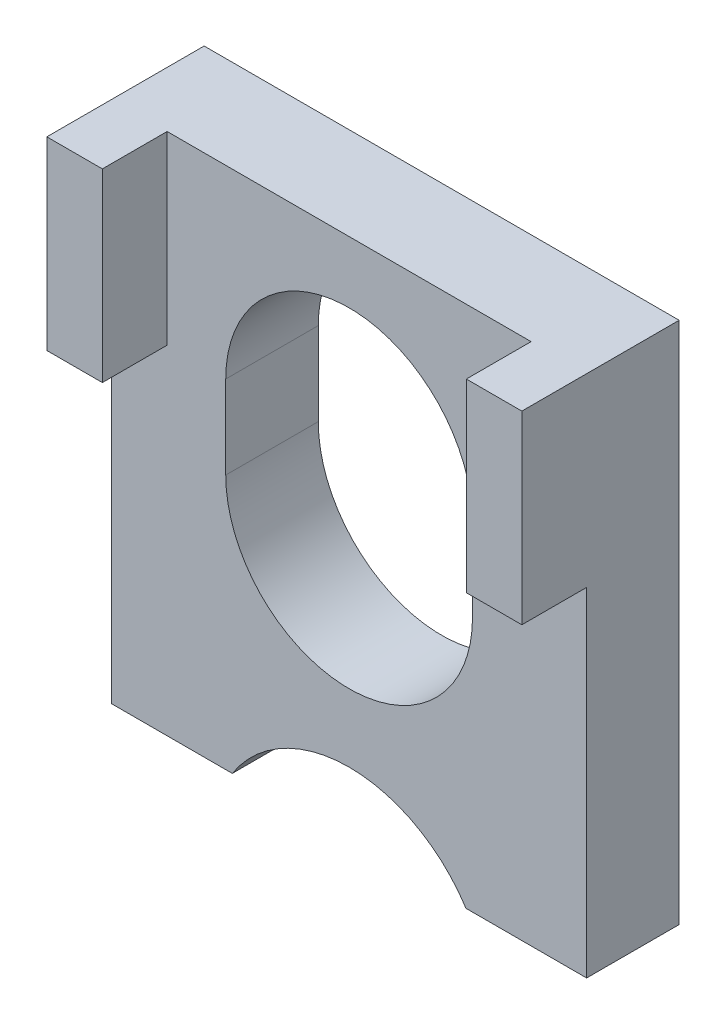
ISO-10303-21;
HEADER;
FILE_DESCRIPTION(('STEP AP214'),'2;1');
FILE_NAME('part.step','',(''),(''),'','','');
FILE_SCHEMA(('AUTOMOTIVE_DESIGN { 1 0 10303 214 1 1 1 1 }'));
ENDSEC;
DATA;
#1=APPLICATION_CONTEXT('core data for automotive mechanical design processes');
#2=APPLICATION_PROTOCOL_DEFINITION('international standard','automotive_design',2000,#1);
#3=PRODUCT_CONTEXT('',#1,'mechanical');
#4=PRODUCT('Part','Part','',(#3));
#5=PRODUCT_RELATED_PRODUCT_CATEGORY('part','',(#4));
#6=PRODUCT_DEFINITION_FORMATION('','',#4);
#7=PRODUCT_DEFINITION_CONTEXT('part definition',#1,'design');
#8=PRODUCT_DEFINITION('design','',#6,#7);
#9=PRODUCT_DEFINITION_SHAPE('','',#8);
#10=(LENGTH_UNIT() NAMED_UNIT(*) SI_UNIT(.MILLI.,.METRE.));
#11=(NAMED_UNIT(*) PLANE_ANGLE_UNIT() SI_UNIT($,.RADIAN.));
#12=(NAMED_UNIT(*) SI_UNIT($,.STERADIAN.) SOLID_ANGLE_UNIT());
#13=UNCERTAINTY_MEASURE_WITH_UNIT(LENGTH_MEASURE(1.E-05),#10,'distance_accuracy_value','');
#14=(GEOMETRIC_REPRESENTATION_CONTEXT(3) GLOBAL_UNCERTAINTY_ASSIGNED_CONTEXT((#13)) GLOBAL_UNIT_ASSIGNED_CONTEXT((#10,
#11,#12)) REPRESENTATION_CONTEXT('',''));
#15=CARTESIAN_POINT('',(0.,0.,0.));
#16=DIRECTION('',(0.,0.,1.));
#17=DIRECTION('',(1.,0.,0.));
#18=AXIS2_PLACEMENT_3D('',#15,#16,#17);
#19=CARTESIAN_POINT('',(0.,-5.65897627091936,3.));
#20=DIRECTION('',(0.,0.,-1.));
#21=DIRECTION('',(-1.,0.,0.));
#22=AXIS2_PLACEMENT_3D('',#19,#20,#21);
#23=PLANE('',#22);
#24=CARTESIAN_POINT('',(0.,7.73749960693732,3.));
#25=DIRECTION('',(0.,0.,1.));
#26=DIRECTION('',(1.,0.,0.));
#27=AXIS2_PLACEMENT_3D('',#24,#25,#26);
#28=CIRCLE('',#27,4.);
#29=CARTESIAN_POINT('',(4.,7.73749960693732,3.));
#30=VERTEX_POINT('',#29);
#31=CARTESIAN_POINT('',(-4.,7.73749960693732,3.));
#32=VERTEX_POINT('',#31);
#33=EDGE_CURVE('E211',#30,#32,#28,.T.);
#34=ORIENTED_EDGE('',*,*,#33,.F.);
#35=DIRECTION('',(0.,1.,0.));
#36=VECTOR('',#35,1.);
#37=CARTESIAN_POINT('',(4.,7.73749960693732,3.));
#38=LINE('',#37,#36);
#39=CARTESIAN_POINT('',(4.,5.04102372908064,3.));
#40=VERTEX_POINT('',#39);
#41=EDGE_CURVE('E219',#40,#30,#38,.T.);
#42=ORIENTED_EDGE('',*,*,#41,.F.);
#43=CARTESIAN_POINT('',(0.,5.04102372908064,3.));
#44=DIRECTION('',(0.,0.,1.));
#45=DIRECTION('',(1.,0.,0.));
#46=AXIS2_PLACEMENT_3D('',#43,#44,#45);
#47=CIRCLE('',#46,4.);
#48=CARTESIAN_POINT('',(-4.,5.04102372908064,3.));
#49=VERTEX_POINT('',#48);
#50=EDGE_CURVE('E216',#49,#40,#47,.T.);
#51=ORIENTED_EDGE('',*,*,#50,.F.);
#52=DIRECTION('',(0.,-1.,0.));
#53=VECTOR('',#52,1.);
#54=CARTESIAN_POINT('',(-4.,7.73749960693732,3.));
#55=LINE('',#54,#53);
#56=EDGE_CURVE('E213',#32,#49,#55,.T.);
#57=ORIENTED_EDGE('',*,*,#56,.F.);
#58=EDGE_LOOP('',(#34,#42,#51,#57));
#59=FACE_BOUND('',#58,.T.);
#60=DIRECTION('',(0.,-1.,0.));
#61=VECTOR('',#60,1.);
#62=CARTESIAN_POINT('',(5.9,13.7374996069373,3.));
#63=LINE('',#62,#61);
#64=CARTESIAN_POINT('',(5.9,13.7374996069373,3.));
#65=VERTEX_POINT('',#64);
#66=CARTESIAN_POINT('',(5.9,7.73749960693732,3.));
#67=VERTEX_POINT('',#66);
#68=EDGE_CURVE('E173',#65,#67,#63,.T.);
#69=ORIENTED_EDGE('',*,*,#68,.F.);
#70=DIRECTION('',(-1.,0.,0.));
#71=VECTOR('',#70,1.);
#72=CARTESIAN_POINT('',(-7.7,13.7374996069373,3.));
#73=LINE('',#72,#71);
#74=CARTESIAN_POINT('',(-5.9,13.7374996069373,3.));
#75=VERTEX_POINT('',#74);
#76=EDGE_CURVE('E252',#65,#75,#73,.T.);
#77=ORIENTED_EDGE('',*,*,#76,.T.);
#78=DIRECTION('',(0.,1.,0.));
#79=VECTOR('',#78,1.);
#80=CARTESIAN_POINT('',(-5.9,13.7374996069373,3.));
#81=LINE('',#80,#79);
#82=CARTESIAN_POINT('',(-5.9,7.73749960693732,3.));
#83=VERTEX_POINT('',#82);
#84=EDGE_CURVE('E190',#83,#75,#81,.T.);
#85=ORIENTED_EDGE('',*,*,#84,.F.);
#86=DIRECTION('',(1.,0.,0.));
#87=VECTOR('',#86,1.);
#88=CARTESIAN_POINT('',(-7.7,7.73749960693732,3.));
#89=LINE('',#88,#87);
#90=CARTESIAN_POINT('',(-7.7,7.73749960693732,3.));
#91=VERTEX_POINT('',#90);
#92=EDGE_CURVE('E185',#91,#83,#89,.T.);
#93=ORIENTED_EDGE('',*,*,#92,.F.);
#94=DIRECTION('',(0.,-1.,0.));
#95=VECTOR('',#94,1.);
#96=CARTESIAN_POINT('',(-7.7,13.7374996069373,3.));
#97=LINE('',#96,#95);
#98=CARTESIAN_POINT('',(-7.7,-3.22973558864937,3.));
#99=VERTEX_POINT('',#98);
#100=EDGE_CURVE('E242',#91,#99,#97,.T.);
#101=ORIENTED_EDGE('',*,*,#100,.T.);
#102=DIRECTION('',(1.,0.,0.));
#103=VECTOR('',#102,1.);
#104=CARTESIAN_POINT('',(-7.7,-3.22973558864937,3.));
#105=LINE('',#104,#103);
#106=CARTESIAN_POINT('',(-3.78797963400074,-3.22973558864937,3.));
#107=VERTEX_POINT('',#106);
#108=EDGE_CURVE('E244',#99,#107,#105,.T.);
#109=ORIENTED_EDGE('',*,*,#108,.T.);
#110=CARTESIAN_POINT('',(0.,-5.65897627091936,3.));
#111=DIRECTION('',(0.,0.,-1.));
#112=DIRECTION('',(-1.,0.,0.));
#113=AXIS2_PLACEMENT_3D('',#110,#111,#112);
#114=CIRCLE('',#113,4.5);
#115=CARTESIAN_POINT('',(3.78797963400074,-3.22973558864937,3.));
#116=VERTEX_POINT('',#115);
#117=EDGE_CURVE('E247',#107,#116,#114,.T.);
#118=ORIENTED_EDGE('',*,*,#117,.T.);
#119=DIRECTION('',(1.,0.,0.));
#120=VECTOR('',#119,1.);
#121=CARTESIAN_POINT('',(7.7,-3.22973558864937,3.));
#122=LINE('',#121,#120);
#123=CARTESIAN_POINT('',(7.7,-3.22973558864937,3.));
#124=VERTEX_POINT('',#123);
#125=EDGE_CURVE('E249',#116,#124,#122,.T.);
#126=ORIENTED_EDGE('',*,*,#125,.T.);
#127=DIRECTION('',(0.,1.,0.));
#128=VECTOR('',#127,1.);
#129=CARTESIAN_POINT('',(7.7,-0.0396047922675049,3.));
#130=LINE('',#129,#128);
#131=CARTESIAN_POINT('',(7.7,7.73749960693732,3.));
#132=VERTEX_POINT('',#131);
#133=EDGE_CURVE('E53',#124,#132,#130,.T.);
#134=ORIENTED_EDGE('',*,*,#133,.T.);
#135=DIRECTION('',(1.,0.,0.));
#136=VECTOR('',#135,1.);
#137=CARTESIAN_POINT('',(7.7,7.73749960693732,3.));
#138=LINE('',#137,#136);
#139=EDGE_CURVE('E48',#67,#132,#138,.T.);
#140=ORIENTED_EDGE('',*,*,#139,.F.);
#141=EDGE_LOOP('',(#69,#77,#85,#93,#101,#109,#118,#126,#134,#140));
#142=FACE_BOUND('',#141,.T.);
#143=ADVANCED_FACE('F33',(#59,#142),#23,.F.);
#144=CARTESIAN_POINT('',(0.,-5.65897627091936,0.));
#145=DIRECTION('',(0.,0.,-1.));
#146=DIRECTION('',(-1.,0.,0.));
#147=AXIS2_PLACEMENT_3D('',#144,#145,#146);
#148=PLANE('',#147);
#149=DIRECTION('',(0.,-1.,0.));
#150=VECTOR('',#149,1.);
#151=CARTESIAN_POINT('',(-7.7,-0.0396047922675089,0.));
#152=LINE('',#151,#150);
#153=CARTESIAN_POINT('',(-7.7,13.7374996069373,0.));
#154=VERTEX_POINT('',#153);
#155=CARTESIAN_POINT('',(-7.7,-3.22973558864937,0.));
#156=VERTEX_POINT('',#155);
#157=EDGE_CURVE('E241',#154,#156,#152,.T.);
#158=ORIENTED_EDGE('',*,*,#157,.F.);
#159=DIRECTION('',(-1.,0.,0.));
#160=VECTOR('',#159,1.);
#161=CARTESIAN_POINT('',(-7.7,13.7374996069373,0.));
#162=LINE('',#161,#160);
#163=CARTESIAN_POINT('',(7.7,13.7374996069373,0.));
#164=VERTEX_POINT('',#163);
#165=EDGE_CURVE('E245',#164,#154,#162,.T.);
#166=ORIENTED_EDGE('',*,*,#165,.F.);
#167=DIRECTION('',(0.,1.,0.));
#168=VECTOR('',#167,1.);
#169=CARTESIAN_POINT('',(7.7,13.7374996069373,0.));
#170=LINE('',#169,#168);
#171=CARTESIAN_POINT('',(7.7,-3.22973558864937,0.));
#172=VERTEX_POINT('',#171);
#173=EDGE_CURVE('E152',#172,#164,#170,.T.);
#174=ORIENTED_EDGE('',*,*,#173,.F.);
#175=DIRECTION('',(1.,0.,0.));
#176=VECTOR('',#175,1.);
#177=CARTESIAN_POINT('',(7.7,-3.22973558864937,0.));
#178=LINE('',#177,#176);
#179=CARTESIAN_POINT('',(3.78797963400074,-3.22973558864937,0.));
#180=VERTEX_POINT('',#179);
#181=EDGE_CURVE('E259',#180,#172,#178,.T.);
#182=ORIENTED_EDGE('',*,*,#181,.F.);
#183=CARTESIAN_POINT('',(0.,-5.65897627091936,0.));
#184=DIRECTION('',(0.,0.,-1.));
#185=DIRECTION('',(-1.,0.,0.));
#186=AXIS2_PLACEMENT_3D('',#183,#184,#185);
#187=CIRCLE('',#186,4.5);
#188=CARTESIAN_POINT('',(-3.78797963400074,-3.22973558864937,0.));
#189=VERTEX_POINT('',#188);
#190=EDGE_CURVE('E257',#189,#180,#187,.T.);
#191=ORIENTED_EDGE('',*,*,#190,.F.);
#192=DIRECTION('',(1.,0.,0.));
#193=VECTOR('',#192,1.);
#194=CARTESIAN_POINT('',(-7.7,-3.22973558864937,0.));
#195=LINE('',#194,#193);
#196=EDGE_CURVE('E255',#156,#189,#195,.T.);
#197=ORIENTED_EDGE('',*,*,#196,.F.);
#198=EDGE_LOOP('',(#158,#166,#174,#182,#191,#197));
#199=FACE_BOUND('',#198,.T.);
#200=DIRECTION('',(0.,1.,0.));
#201=VECTOR('',#200,1.);
#202=CARTESIAN_POINT('',(4.,7.73749960693732,0.));
#203=LINE('',#202,#201);
#204=CARTESIAN_POINT('',(4.,5.04102372908064,0.));
#205=VERTEX_POINT('',#204);
#206=CARTESIAN_POINT('',(4.,7.73749960693732,0.));
#207=VERTEX_POINT('',#206);
#208=EDGE_CURVE('E214',#205,#207,#203,.T.);
#209=ORIENTED_EDGE('',*,*,#208,.T.);
#210=CARTESIAN_POINT('',(0.,7.73749960693732,0.));
#211=DIRECTION('',(0.,0.,1.));
#212=DIRECTION('',(1.,0.,0.));
#213=AXIS2_PLACEMENT_3D('',#210,#211,#212);
#214=CIRCLE('',#213,4.);
#215=CARTESIAN_POINT('',(-4.,7.73749960693732,0.));
#216=VERTEX_POINT('',#215);
#217=EDGE_CURVE('E210',#207,#216,#214,.T.);
#218=ORIENTED_EDGE('',*,*,#217,.T.);
#219=DIRECTION('',(0.,-1.,0.));
#220=VECTOR('',#219,1.);
#221=CARTESIAN_POINT('',(-4.,7.73749960693732,0.));
#222=LINE('',#221,#220);
#223=CARTESIAN_POINT('',(-4.,5.04102372908064,0.));
#224=VERTEX_POINT('',#223);
#225=EDGE_CURVE('E224',#216,#224,#222,.T.);
#226=ORIENTED_EDGE('',*,*,#225,.T.);
#227=CARTESIAN_POINT('',(0.,5.04102372908064,0.));
#228=DIRECTION('',(0.,0.,1.));
#229=DIRECTION('',(1.,0.,0.));
#230=AXIS2_PLACEMENT_3D('',#227,#228,#229);
#231=CIRCLE('',#230,4.);
#232=EDGE_CURVE('E227',#224,#205,#231,.T.);
#233=ORIENTED_EDGE('',*,*,#232,.T.);
#234=EDGE_LOOP('',(#209,#218,#226,#233));
#235=FACE_BOUND('',#234,.T.);
#236=ADVANCED_FACE('F281',(#199,#235),#148,.T.);
#237=CARTESIAN_POINT('',(-7.7,-0.0396047922675089,3.));
#238=DIRECTION('',(1.,0.,0.));
#239=DIRECTION('',(0.,0.,-1.));
#240=AXIS2_PLACEMENT_3D('',#237,#238,#239);
#241=PLANE('',#240);
#242=ORIENTED_EDGE('',*,*,#157,.T.);
#243=DIRECTION('',(0.,0.,-1.));
#244=VECTOR('',#243,1.);
#245=CARTESIAN_POINT('',(-7.7,-3.22973558864937,3.));
#246=LINE('',#245,#244);
#247=EDGE_CURVE('E11',#99,#156,#246,.T.);
#248=ORIENTED_EDGE('',*,*,#247,.F.);
#249=ORIENTED_EDGE('',*,*,#100,.F.);
#250=DIRECTION('',(0.,0.,-1.));
#251=VECTOR('',#250,1.);
#252=CARTESIAN_POINT('',(-7.7,7.73749960693732,5.1));
#253=LINE('',#252,#251);
#254=CARTESIAN_POINT('',(-7.7,7.73749960693732,5.1));
#255=VERTEX_POINT('',#254);
#256=EDGE_CURVE('E207',#255,#91,#253,.T.);
#257=ORIENTED_EDGE('',*,*,#256,.F.);
#258=DIRECTION('',(0.,-1.,0.));
#259=VECTOR('',#258,1.);
#260=CARTESIAN_POINT('',(-7.7,13.7374996069373,5.1));
#261=LINE('',#260,#259);
#262=CARTESIAN_POINT('',(-7.7,13.7374996069373,5.1));
#263=VERTEX_POINT('',#262);
#264=EDGE_CURVE('E186',#263,#255,#261,.T.);
#265=ORIENTED_EDGE('',*,*,#264,.F.);
#266=DIRECTION('',(0.,0.,-1.));
#267=VECTOR('',#266,1.);
#268=CARTESIAN_POINT('',(-7.7,13.7374996069373,3.));
#269=LINE('',#268,#267);
#270=EDGE_CURVE('E157',#263,#154,#269,.T.);
#271=ORIENTED_EDGE('',*,*,#270,.T.);
#272=EDGE_LOOP('',(#242,#248,#249,#257,#265,#271));
#273=FACE_BOUND('',#272,.T.);
#274=ADVANCED_FACE('F35',(#273),#241,.F.);
#275=CARTESIAN_POINT('',(-7.7,-3.22973558864937,3.));
#276=DIRECTION('',(0.,1.,0.));
#277=DIRECTION('',(0.,0.,1.));
#278=AXIS2_PLACEMENT_3D('',#275,#276,#277);
#279=PLANE('',#278);
#280=ORIENTED_EDGE('',*,*,#196,.T.);
#281=DIRECTION('',(0.,0.,-1.));
#282=VECTOR('',#281,1.);
#283=CARTESIAN_POINT('',(-3.78797963400074,-3.22973558864937,3.));
#284=LINE('',#283,#282);
#285=EDGE_CURVE('E41',#107,#189,#284,.T.);
#286=ORIENTED_EDGE('',*,*,#285,.F.);
#287=ORIENTED_EDGE('',*,*,#108,.F.);
#288=ORIENTED_EDGE('',*,*,#247,.T.);
#289=EDGE_LOOP('',(#280,#286,#287,#288));
#290=FACE_BOUND('',#289,.T.);
#291=ADVANCED_FACE('F307',(#290),#279,.F.);
#292=CARTESIAN_POINT('',(0.,-5.65897627091936,3.));
#293=DIRECTION('',(0.,0.,-1.));
#294=DIRECTION('',(-1.,0.,0.));
#295=AXIS2_PLACEMENT_3D('',#292,#293,#294);
#296=CYLINDRICAL_SURFACE('',#295,4.5);
#297=ORIENTED_EDGE('',*,*,#190,.T.);
#298=DIRECTION('',(0.,0.,-1.));
#299=VECTOR('',#298,1.);
#300=CARTESIAN_POINT('',(3.78797963400074,-3.22973558864937,3.));
#301=LINE('',#300,#299);
#302=EDGE_CURVE('E267',#116,#180,#301,.T.);
#303=ORIENTED_EDGE('',*,*,#302,.F.);
#304=ORIENTED_EDGE('',*,*,#117,.F.);
#305=ORIENTED_EDGE('',*,*,#285,.T.);
#306=EDGE_LOOP('',(#297,#303,#304,#305));
#307=FACE_BOUND('',#306,.T.);
#308=ADVANCED_FACE('F274',(#307),#296,.F.);
#309=CARTESIAN_POINT('',(7.7,-3.22973558864937,3.));
#310=DIRECTION('',(0.,1.,0.));
#311=DIRECTION('',(-1.,0.,0.));
#312=AXIS2_PLACEMENT_3D('',#309,#310,#311);
#313=PLANE('',#312);
#314=ORIENTED_EDGE('',*,*,#181,.T.);
#315=DIRECTION('',(0.,0.,-1.));
#316=VECTOR('',#315,1.);
#317=CARTESIAN_POINT('',(7.7,-3.22973558864937,3.));
#318=LINE('',#317,#316);
#319=EDGE_CURVE('E156',#124,#172,#318,.T.);
#320=ORIENTED_EDGE('',*,*,#319,.F.);
#321=ORIENTED_EDGE('',*,*,#125,.F.);
#322=ORIENTED_EDGE('',*,*,#302,.T.);
#323=EDGE_LOOP('',(#314,#320,#321,#322));
#324=FACE_BOUND('',#323,.T.);
#325=ADVANCED_FACE('F285',(#324),#313,.F.);
#326=CARTESIAN_POINT('',(7.7,13.7374996069373,3.));
#327=DIRECTION('',(-1.,0.,0.));
#328=DIRECTION('',(0.,-1.,0.));
#329=AXIS2_PLACEMENT_3D('',#326,#327,#328);
#330=PLANE('',#329);
#331=ORIENTED_EDGE('',*,*,#173,.T.);
#332=DIRECTION('',(0.,0.,-1.));
#333=VECTOR('',#332,1.);
#334=CARTESIAN_POINT('',(7.7,13.7374996069373,3.));
#335=LINE('',#334,#333);
#336=CARTESIAN_POINT('',(7.7,13.7374996069373,5.1));
#337=VERTEX_POINT('',#336);
#338=EDGE_CURVE('E145',#337,#164,#335,.T.);
#339=ORIENTED_EDGE('',*,*,#338,.F.);
#340=DIRECTION('',(0.,1.,0.));
#341=VECTOR('',#340,1.);
#342=CARTESIAN_POINT('',(7.7,13.7374996069373,5.1));
#343=LINE('',#342,#341);
#344=CARTESIAN_POINT('',(7.7,7.73749960693732,5.1));
#345=VERTEX_POINT('',#344);
#346=EDGE_CURVE('E150',#345,#337,#343,.T.);
#347=ORIENTED_EDGE('',*,*,#346,.F.);
#348=DIRECTION('',(0.,0.,-1.));
#349=VECTOR('',#348,1.);
#350=CARTESIAN_POINT('',(7.7,7.73749960693732,5.1));
#351=LINE('',#350,#349);
#352=EDGE_CURVE('E178',#345,#132,#351,.T.);
#353=ORIENTED_EDGE('',*,*,#352,.T.);
#354=ORIENTED_EDGE('',*,*,#133,.F.);
#355=ORIENTED_EDGE('',*,*,#319,.T.);
#356=EDGE_LOOP('',(#331,#339,#347,#353,#354,#355));
#357=FACE_BOUND('',#356,.T.);
#358=ADVANCED_FACE('F147',(#357),#330,.F.);
#359=CARTESIAN_POINT('',(-7.7,13.7374996069373,3.));
#360=DIRECTION('',(0.,-1.,0.));
#361=DIRECTION('',(0.,0.,-1.));
#362=AXIS2_PLACEMENT_3D('',#359,#360,#361);
#363=PLANE('',#362);
#364=ORIENTED_EDGE('',*,*,#165,.T.);
#365=ORIENTED_EDGE('',*,*,#270,.F.);
#366=DIRECTION('',(-1.,0.,0.));
#367=VECTOR('',#366,1.);
#368=CARTESIAN_POINT('',(-7.7,13.7374996069373,5.1));
#369=LINE('',#368,#367);
#370=CARTESIAN_POINT('',(-5.9,13.7374996069373,5.1));
#371=VERTEX_POINT('',#370);
#372=EDGE_CURVE('E194',#371,#263,#369,.T.);
#373=ORIENTED_EDGE('',*,*,#372,.F.);
#374=DIRECTION('',(0.,0.,-1.));
#375=VECTOR('',#374,1.);
#376=CARTESIAN_POINT('',(-5.9,13.7374996069373,5.1));
#377=LINE('',#376,#375);
#378=EDGE_CURVE('E197',#371,#75,#377,.T.);
#379=ORIENTED_EDGE('',*,*,#378,.T.);
#380=ORIENTED_EDGE('',*,*,#76,.F.);
#381=DIRECTION('',(0.,0.,-1.));
#382=VECTOR('',#381,1.);
#383=CARTESIAN_POINT('',(5.9,13.7374996069373,5.1));
#384=LINE('',#383,#382);
#385=CARTESIAN_POINT('',(5.9,13.7374996069373,5.1));
#386=VERTEX_POINT('',#385);
#387=EDGE_CURVE('E163',#386,#65,#384,.T.);
#388=ORIENTED_EDGE('',*,*,#387,.F.);
#389=DIRECTION('',(-1.,0.,0.));
#390=VECTOR('',#389,1.);
#391=CARTESIAN_POINT('',(7.7,13.7374996069373,5.1));
#392=LINE('',#391,#390);
#393=EDGE_CURVE('E160',#337,#386,#392,.T.);
#394=ORIENTED_EDGE('',*,*,#393,.F.);
#395=ORIENTED_EDGE('',*,*,#338,.T.);
#396=EDGE_LOOP('',(#364,#365,#373,#379,#380,#388,#394,#395));
#397=FACE_BOUND('',#396,.T.);
#398=ADVANCED_FACE('F161',(#397),#363,.F.);
#399=CARTESIAN_POINT('',(0.,7.73749960693732,3.));
#400=DIRECTION('',(0.,0.,-1.));
#401=DIRECTION('',(-1.,0.,0.));
#402=AXIS2_PLACEMENT_3D('',#399,#400,#401);
#403=CYLINDRICAL_SURFACE('',#402,4.);
#404=ORIENTED_EDGE('',*,*,#217,.F.);
#405=DIRECTION('',(0.,0.,-1.));
#406=VECTOR('',#405,1.);
#407=CARTESIAN_POINT('',(4.,7.73749960693732,3.));
#408=LINE('',#407,#406);
#409=EDGE_CURVE('E221',#30,#207,#408,.T.);
#410=ORIENTED_EDGE('',*,*,#409,.F.);
#411=ORIENTED_EDGE('',*,*,#33,.T.);
#412=DIRECTION('',(0.,0.,-1.));
#413=VECTOR('',#412,1.);
#414=CARTESIAN_POINT('',(-4.,7.73749960693732,3.));
#415=LINE('',#414,#413);
#416=EDGE_CURVE('E238',#32,#216,#415,.T.);
#417=ORIENTED_EDGE('',*,*,#416,.T.);
#418=EDGE_LOOP('',(#404,#410,#411,#417));
#419=FACE_BOUND('',#418,.T.);
#420=ADVANCED_FACE('F323',(#419),#403,.F.);
#421=CARTESIAN_POINT('',(-4.,7.73749960693732,3.));
#422=DIRECTION('',(1.,0.,0.));
#423=DIRECTION('',(0.,1.,0.));
#424=AXIS2_PLACEMENT_3D('',#421,#422,#423);
#425=PLANE('',#424);
#426=ORIENTED_EDGE('',*,*,#225,.F.);
#427=ORIENTED_EDGE('',*,*,#416,.F.);
#428=ORIENTED_EDGE('',*,*,#56,.T.);
#429=DIRECTION('',(0.,0.,-1.));
#430=VECTOR('',#429,1.);
#431=CARTESIAN_POINT('',(-4.,5.04102372908064,3.));
#432=LINE('',#431,#430);
#433=EDGE_CURVE('E236',#49,#224,#432,.T.);
#434=ORIENTED_EDGE('',*,*,#433,.T.);
#435=EDGE_LOOP('',(#426,#427,#428,#434));
#436=FACE_BOUND('',#435,.T.);
#437=ADVANCED_FACE('F351',(#436),#425,.T.);
#438=CARTESIAN_POINT('',(0.,5.04102372908064,3.));
#439=DIRECTION('',(0.,0.,-1.));
#440=DIRECTION('',(-1.,0.,0.));
#441=AXIS2_PLACEMENT_3D('',#438,#439,#440);
#442=CYLINDRICAL_SURFACE('',#441,4.);
#443=ORIENTED_EDGE('',*,*,#232,.F.);
#444=ORIENTED_EDGE('',*,*,#433,.F.);
#445=ORIENTED_EDGE('',*,*,#50,.T.);
#446=DIRECTION('',(0.,0.,-1.));
#447=VECTOR('',#446,1.);
#448=CARTESIAN_POINT('',(4.,5.04102372908064,3.));
#449=LINE('',#448,#447);
#450=EDGE_CURVE('E234',#40,#205,#449,.T.);
#451=ORIENTED_EDGE('',*,*,#450,.T.);
#452=EDGE_LOOP('',(#443,#444,#445,#451));
#453=FACE_BOUND('',#452,.T.);
#454=ADVANCED_FACE('F358',(#453),#442,.F.);
#455=CARTESIAN_POINT('',(4.,7.73749960693732,3.));
#456=DIRECTION('',(-1.,0.,0.));
#457=DIRECTION('',(0.,-1.,0.));
#458=AXIS2_PLACEMENT_3D('',#455,#456,#457);
#459=PLANE('',#458);
#460=ORIENTED_EDGE('',*,*,#208,.F.);
#461=ORIENTED_EDGE('',*,*,#450,.F.);
#462=ORIENTED_EDGE('',*,*,#41,.T.);
#463=ORIENTED_EDGE('',*,*,#409,.T.);
#464=EDGE_LOOP('',(#460,#461,#462,#463));
#465=FACE_BOUND('',#464,.T.);
#466=ADVANCED_FACE('F365',(#465),#459,.T.);
#467=CARTESIAN_POINT('',(-7.7,7.73749960693732,5.1));
#468=DIRECTION('',(0.,1.,0.));
#469=DIRECTION('',(0.,0.,1.));
#470=AXIS2_PLACEMENT_3D('',#467,#468,#469);
#471=PLANE('',#470);
#472=ORIENTED_EDGE('',*,*,#92,.T.);
#473=DIRECTION('',(0.,0.,-1.));
#474=VECTOR('',#473,1.);
#475=CARTESIAN_POINT('',(-5.9,7.73749960693732,5.1));
#476=LINE('',#475,#474);
#477=CARTESIAN_POINT('',(-5.9,7.73749960693732,5.1));
#478=VERTEX_POINT('',#477);
#479=EDGE_CURVE('E204',#478,#83,#476,.T.);
#480=ORIENTED_EDGE('',*,*,#479,.F.);
#481=DIRECTION('',(1.,0.,0.));
#482=VECTOR('',#481,1.);
#483=CARTESIAN_POINT('',(-7.7,7.73749960693732,5.1));
#484=LINE('',#483,#482);
#485=EDGE_CURVE('E189',#255,#478,#484,.T.);
#486=ORIENTED_EDGE('',*,*,#485,.F.);
#487=ORIENTED_EDGE('',*,*,#256,.T.);
#488=EDGE_LOOP('',(#472,#480,#486,#487));
#489=FACE_BOUND('',#488,.T.);
#490=ADVANCED_FACE('F306',(#489),#471,.F.);
#491=CARTESIAN_POINT('',(-5.9,13.7374996069373,5.1));
#492=DIRECTION('',(-1.,0.,0.));
#493=DIRECTION('',(0.,-1.,0.));
#494=AXIS2_PLACEMENT_3D('',#491,#492,#493);
#495=PLANE('',#494);
#496=ORIENTED_EDGE('',*,*,#84,.T.);
#497=ORIENTED_EDGE('',*,*,#378,.F.);
#498=DIRECTION('',(0.,1.,0.));
#499=VECTOR('',#498,1.);
#500=CARTESIAN_POINT('',(-5.9,13.7374996069373,5.1));
#501=LINE('',#500,#499);
#502=EDGE_CURVE('E192',#478,#371,#501,.T.);
#503=ORIENTED_EDGE('',*,*,#502,.F.);
#504=ORIENTED_EDGE('',*,*,#479,.T.);
#505=EDGE_LOOP('',(#496,#497,#503,#504));
#506=FACE_BOUND('',#505,.T.);
#507=ADVANCED_FACE('F294',(#506),#495,.F.);
#508=CARTESIAN_POINT('',(0.,0.,5.1));
#509=DIRECTION('',(0.,0.,1.));
#510=DIRECTION('',(1.,0.,0.));
#511=AXIS2_PLACEMENT_3D('',#508,#509,#510);
#512=PLANE('',#511);
#513=ORIENTED_EDGE('',*,*,#264,.T.);
#514=ORIENTED_EDGE('',*,*,#485,.T.);
#515=ORIENTED_EDGE('',*,*,#502,.T.);
#516=ORIENTED_EDGE('',*,*,#372,.T.);
#517=EDGE_LOOP('',(#513,#514,#515,#516));
#518=FACE_BOUND('',#517,.T.);
#519=ADVANCED_FACE('F300',(#518),#512,.T.);
#520=CARTESIAN_POINT('',(5.9,13.7374996069373,5.1));
#521=DIRECTION('',(1.,0.,0.));
#522=DIRECTION('',(0.,1.,0.));
#523=AXIS2_PLACEMENT_3D('',#520,#521,#522);
#524=PLANE('',#523);
#525=ORIENTED_EDGE('',*,*,#68,.T.);
#526=DIRECTION('',(0.,0.,-1.));
#527=VECTOR('',#526,1.);
#528=CARTESIAN_POINT('',(5.9,7.73749960693732,5.1));
#529=LINE('',#528,#527);
#530=CARTESIAN_POINT('',(5.9,7.73749960693732,5.1));
#531=VERTEX_POINT('',#530);
#532=EDGE_CURVE('E181',#531,#67,#529,.T.);
#533=ORIENTED_EDGE('',*,*,#532,.F.);
#534=DIRECTION('',(0.,-1.,0.));
#535=VECTOR('',#534,1.);
#536=CARTESIAN_POINT('',(5.9,13.7374996069373,5.1));
#537=LINE('',#536,#535);
#538=EDGE_CURVE('E166',#386,#531,#537,.T.);
#539=ORIENTED_EDGE('',*,*,#538,.F.);
#540=ORIENTED_EDGE('',*,*,#387,.T.);
#541=EDGE_LOOP('',(#525,#533,#539,#540));
#542=FACE_BOUND('',#541,.T.);
#543=ADVANCED_FACE('F291',(#542),#524,.F.);
#544=CARTESIAN_POINT('',(7.7,7.73749960693732,5.1));
#545=DIRECTION('',(0.,1.,0.));
#546=DIRECTION('',(0.,0.,1.));
#547=AXIS2_PLACEMENT_3D('',#544,#545,#546);
#548=PLANE('',#547);
#549=ORIENTED_EDGE('',*,*,#139,.T.);
#550=ORIENTED_EDGE('',*,*,#352,.F.);
#551=DIRECTION('',(1.,0.,0.));
#552=VECTOR('',#551,1.);
#553=CARTESIAN_POINT('',(7.7,7.73749960693732,5.1));
#554=LINE('',#553,#552);
#555=EDGE_CURVE('E170',#531,#345,#554,.T.);
#556=ORIENTED_EDGE('',*,*,#555,.F.);
#557=ORIENTED_EDGE('',*,*,#532,.T.);
#558=EDGE_LOOP('',(#549,#550,#556,#557));
#559=FACE_BOUND('',#558,.T.);
#560=ADVANCED_FACE('F288',(#559),#548,.F.);
#561=CARTESIAN_POINT('',(0.,0.,5.1));
#562=DIRECTION('',(0.,0.,-1.));
#563=DIRECTION('',(-1.,0.,0.));
#564=AXIS2_PLACEMENT_3D('',#561,#562,#563);
#565=PLANE('',#564);
#566=ORIENTED_EDGE('',*,*,#346,.T.);
#567=ORIENTED_EDGE('',*,*,#393,.T.);
#568=ORIENTED_EDGE('',*,*,#538,.T.);
#569=ORIENTED_EDGE('',*,*,#555,.T.);
#570=EDGE_LOOP('',(#566,#567,#568,#569));
#571=FACE_BOUND('',#570,.T.);
#572=ADVANCED_FACE('F168',(#571),#565,.F.);
#573=CLOSED_SHELL('',(#143,#236,#274,#291,#308,#325,#358,#398,#420,#437,#454,#466,#490,#507,
#519,#543,#560,#572));
#574=MANIFOLD_SOLID_BREP('B2',#573);
#575=ADVANCED_BREP_SHAPE_REPRESENTATION('',(#18,#574),#14);
#576=SHAPE_DEFINITION_REPRESENTATION(#9,#575);
ENDSEC;
END-ISO-10303-21;
